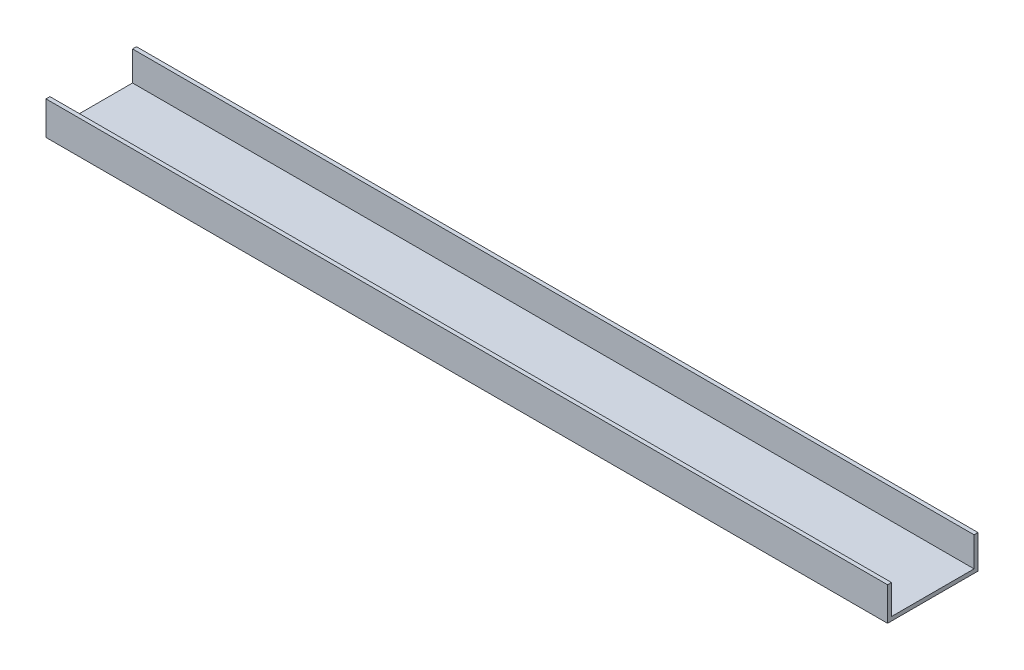
ISO-10303-21;
HEADER;
FILE_DESCRIPTION(('STEP AP214'),'2;1');
FILE_NAME('part.step','',(''),(''),'','','');
FILE_SCHEMA(('AUTOMOTIVE_DESIGN { 1 0 10303 214 1 1 1 1 }'));
ENDSEC;
DATA;
#1=APPLICATION_CONTEXT('core data for automotive mechanical design processes');
#2=APPLICATION_PROTOCOL_DEFINITION('international standard','automotive_design',2000,#1);
#3=PRODUCT_CONTEXT('',#1,'mechanical');
#4=PRODUCT('Part','Part','',(#3));
#5=PRODUCT_RELATED_PRODUCT_CATEGORY('part','',(#4));
#6=PRODUCT_DEFINITION_FORMATION('','',#4);
#7=PRODUCT_DEFINITION_CONTEXT('part definition',#1,'design');
#8=PRODUCT_DEFINITION('design','',#6,#7);
#9=PRODUCT_DEFINITION_SHAPE('','',#8);
#10=(LENGTH_UNIT() NAMED_UNIT(*) SI_UNIT(.MILLI.,.METRE.));
#11=(NAMED_UNIT(*) PLANE_ANGLE_UNIT() SI_UNIT($,.RADIAN.));
#12=(NAMED_UNIT(*) SI_UNIT($,.STERADIAN.) SOLID_ANGLE_UNIT());
#13=UNCERTAINTY_MEASURE_WITH_UNIT(LENGTH_MEASURE(1.E-05),#10,'distance_accuracy_value','');
#14=(GEOMETRIC_REPRESENTATION_CONTEXT(3) GLOBAL_UNCERTAINTY_ASSIGNED_CONTEXT((#13)) GLOBAL_UNIT_ASSIGNED_CONTEXT((#10,
#11,#12)) REPRESENTATION_CONTEXT('',''));
#15=CARTESIAN_POINT('',(0.,0.,0.));
#16=DIRECTION('',(0.,0.,1.));
#17=DIRECTION('',(1.,0.,0.));
#18=AXIS2_PLACEMENT_3D('',#15,#16,#17);
#19=CARTESIAN_POINT('',(214.,4.25,4.));
#20=DIRECTION('',(0.,-1.,0.));
#21=DIRECTION('',(0.,0.,-1.));
#22=AXIS2_PLACEMENT_3D('',#19,#20,#21);
#23=PLANE('',#22);
#24=DIRECTION('',(0.,0.,1.));
#25=VECTOR('',#24,1.);
#26=CARTESIAN_POINT('',(0.,4.25,4.));
#27=LINE('',#26,#25);
#28=CARTESIAN_POINT('',(0.,4.25,4.));
#29=VERTEX_POINT('',#28);
#30=CARTESIAN_POINT('',(0.,4.25,5.));
#31=VERTEX_POINT('',#30);
#32=EDGE_CURVE('E127',#29,#31,#27,.T.);
#33=ORIENTED_EDGE('',*,*,#32,.T.);
#34=DIRECTION('',(-1.,0.,0.));
#35=VECTOR('',#34,1.);
#36=CARTESIAN_POINT('',(214.,4.25,5.));
#37=LINE('',#36,#35);
#38=CARTESIAN_POINT('',(214.,4.25,5.));
#39=VERTEX_POINT('',#38);
#40=EDGE_CURVE('E11',#39,#31,#37,.T.);
#41=ORIENTED_EDGE('',*,*,#40,.F.);
#42=DIRECTION('',(0.,0.,1.));
#43=VECTOR('',#42,1.);
#44=CARTESIAN_POINT('',(214.,4.25,4.));
#45=LINE('',#44,#43);
#46=CARTESIAN_POINT('',(214.,4.25,4.));
#47=VERTEX_POINT('',#46);
#48=EDGE_CURVE('E141',#47,#39,#45,.T.);
#49=ORIENTED_EDGE('',*,*,#48,.F.);
#50=DIRECTION('',(-1.,0.,0.));
#51=VECTOR('',#50,1.);
#52=CARTESIAN_POINT('',(214.,4.25,4.));
#53=LINE('',#52,#51);
#54=EDGE_CURVE('E123',#47,#29,#53,.T.);
#55=ORIENTED_EDGE('',*,*,#54,.T.);
#56=EDGE_LOOP('',(#33,#41,#49,#55));
#57=FACE_BOUND('',#56,.T.);
#58=ADVANCED_FACE('F31',(#57),#23,.F.);
#59=CARTESIAN_POINT('',(214.,-4.25,5.));
#60=DIRECTION('',(0.,0.,-1.));
#61=DIRECTION('',(-1.,0.,0.));
#62=AXIS2_PLACEMENT_3D('',#59,#60,#61);
#63=PLANE('',#62);
#64=DIRECTION('',(0.,-1.,0.));
#65=VECTOR('',#64,1.);
#66=CARTESIAN_POINT('',(0.,-4.25,5.));
#67=LINE('',#66,#65);
#68=CARTESIAN_POINT('',(0.,-4.25,5.));
#69=VERTEX_POINT('',#68);
#70=EDGE_CURVE('E130',#31,#69,#67,.T.);
#71=ORIENTED_EDGE('',*,*,#70,.T.);
#72=DIRECTION('',(-1.,0.,0.));
#73=VECTOR('',#72,1.);
#74=CARTESIAN_POINT('',(214.,-4.25,5.));
#75=LINE('',#74,#73);
#76=CARTESIAN_POINT('',(214.,-4.25,5.));
#77=VERTEX_POINT('',#76);
#78=EDGE_CURVE('E39',#77,#69,#75,.T.);
#79=ORIENTED_EDGE('',*,*,#78,.F.);
#80=DIRECTION('',(0.,-1.,0.));
#81=VECTOR('',#80,1.);
#82=CARTESIAN_POINT('',(214.,-4.25,5.));
#83=LINE('',#82,#81);
#84=EDGE_CURVE('E90',#39,#77,#83,.T.);
#85=ORIENTED_EDGE('',*,*,#84,.F.);
#86=ORIENTED_EDGE('',*,*,#40,.T.);
#87=EDGE_LOOP('',(#71,#79,#85,#86));
#88=FACE_BOUND('',#87,.T.);
#89=ADVANCED_FACE('F176',(#88),#63,.F.);
#90=CARTESIAN_POINT('',(214.,-4.25,-18.));
#91=DIRECTION('',(0.,1.,0.));
#92=DIRECTION('',(0.,0.,1.));
#93=AXIS2_PLACEMENT_3D('',#90,#91,#92);
#94=PLANE('',#93);
#95=DIRECTION('',(0.,0.,-1.));
#96=VECTOR('',#95,1.);
#97=CARTESIAN_POINT('',(0.,-4.25,-18.));
#98=LINE('',#97,#96);
#99=CARTESIAN_POINT('',(0.,-4.25,-18.));
#100=VERTEX_POINT('',#99);
#101=EDGE_CURVE('E132',#69,#100,#98,.T.);
#102=ORIENTED_EDGE('',*,*,#101,.T.);
#103=DIRECTION('',(-1.,0.,0.));
#104=VECTOR('',#103,1.);
#105=CARTESIAN_POINT('',(214.,-4.25,-18.));
#106=LINE('',#105,#104);
#107=CARTESIAN_POINT('',(214.,-4.25,-18.));
#108=VERTEX_POINT('',#107);
#109=EDGE_CURVE('E148',#108,#100,#106,.T.);
#110=ORIENTED_EDGE('',*,*,#109,.F.);
#111=DIRECTION('',(0.,0.,-1.));
#112=VECTOR('',#111,1.);
#113=CARTESIAN_POINT('',(214.,-4.25,-18.));
#114=LINE('',#113,#112);
#115=EDGE_CURVE('E156',#77,#108,#114,.T.);
#116=ORIENTED_EDGE('',*,*,#115,.F.);
#117=ORIENTED_EDGE('',*,*,#78,.T.);
#118=EDGE_LOOP('',(#102,#110,#116,#117));
#119=FACE_BOUND('',#118,.T.);
#120=ADVANCED_FACE('F154',(#119),#94,.F.);
#121=CARTESIAN_POINT('',(214.,-4.25,-18.));
#122=DIRECTION('',(0.,0.,1.));
#123=DIRECTION('',(1.,0.,0.));
#124=AXIS2_PLACEMENT_3D('',#121,#122,#123);
#125=PLANE('',#124);
#126=DIRECTION('',(0.,1.,0.));
#127=VECTOR('',#126,1.);
#128=CARTESIAN_POINT('',(0.,-4.25,-18.));
#129=LINE('',#128,#127);
#130=CARTESIAN_POINT('',(0.,4.25,-18.));
#131=VERTEX_POINT('',#130);
#132=EDGE_CURVE('E134',#100,#131,#129,.T.);
#133=ORIENTED_EDGE('',*,*,#132,.T.);
#134=DIRECTION('',(-1.,0.,0.));
#135=VECTOR('',#134,1.);
#136=CARTESIAN_POINT('',(214.,4.25,-18.));
#137=LINE('',#136,#135);
#138=CARTESIAN_POINT('',(214.,4.25,-18.));
#139=VERTEX_POINT('',#138);
#140=EDGE_CURVE('E145',#139,#131,#137,.T.);
#141=ORIENTED_EDGE('',*,*,#140,.F.);
#142=DIRECTION('',(0.,1.,0.));
#143=VECTOR('',#142,1.);
#144=CARTESIAN_POINT('',(214.,-4.25,-18.));
#145=LINE('',#144,#143);
#146=EDGE_CURVE('E168',#108,#139,#145,.T.);
#147=ORIENTED_EDGE('',*,*,#146,.F.);
#148=ORIENTED_EDGE('',*,*,#109,.T.);
#149=EDGE_LOOP('',(#133,#141,#147,#148));
#150=FACE_BOUND('',#149,.T.);
#151=ADVANCED_FACE('F164',(#150),#125,.F.);
#152=CARTESIAN_POINT('',(214.,4.25,-18.));
#153=DIRECTION('',(0.,-1.,0.));
#154=DIRECTION('',(0.,0.,-1.));
#155=AXIS2_PLACEMENT_3D('',#152,#153,#154);
#156=PLANE('',#155);
#157=DIRECTION('',(0.,0.,1.));
#158=VECTOR('',#157,1.);
#159=CARTESIAN_POINT('',(0.,4.25,-18.));
#160=LINE('',#159,#158);
#161=CARTESIAN_POINT('',(0.,4.25,-17.));
#162=VERTEX_POINT('',#161);
#163=EDGE_CURVE('E136',#131,#162,#160,.T.);
#164=ORIENTED_EDGE('',*,*,#163,.T.);
#165=DIRECTION('',(-1.,0.,0.));
#166=VECTOR('',#165,1.);
#167=CARTESIAN_POINT('',(214.,4.25,-17.));
#168=LINE('',#167,#166);
#169=CARTESIAN_POINT('',(214.,4.25,-17.));
#170=VERTEX_POINT('',#169);
#171=EDGE_CURVE('E118',#170,#162,#168,.T.);
#172=ORIENTED_EDGE('',*,*,#171,.F.);
#173=DIRECTION('',(0.,0.,1.));
#174=VECTOR('',#173,1.);
#175=CARTESIAN_POINT('',(214.,4.25,-18.));
#176=LINE('',#175,#174);
#177=EDGE_CURVE('E109',#139,#170,#176,.T.);
#178=ORIENTED_EDGE('',*,*,#177,.F.);
#179=ORIENTED_EDGE('',*,*,#140,.T.);
#180=EDGE_LOOP('',(#164,#172,#178,#179));
#181=FACE_BOUND('',#180,.T.);
#182=ADVANCED_FACE('F167',(#181),#156,.F.);
#183=CARTESIAN_POINT('',(214.,-3.25,-17.));
#184=DIRECTION('',(0.,0.,-1.));
#185=DIRECTION('',(-1.,0.,0.));
#186=AXIS2_PLACEMENT_3D('',#183,#184,#185);
#187=PLANE('',#186);
#188=DIRECTION('',(0.,-1.,0.));
#189=VECTOR('',#188,1.);
#190=CARTESIAN_POINT('',(0.,-3.25,-17.));
#191=LINE('',#190,#189);
#192=CARTESIAN_POINT('',(0.,-3.25,-17.));
#193=VERTEX_POINT('',#192);
#194=EDGE_CURVE('E117',#162,#193,#191,.T.);
#195=ORIENTED_EDGE('',*,*,#194,.T.);
#196=DIRECTION('',(-1.,0.,0.));
#197=VECTOR('',#196,1.);
#198=CARTESIAN_POINT('',(214.,-3.25,-17.));
#199=LINE('',#198,#197);
#200=CARTESIAN_POINT('',(214.,-3.25,-17.));
#201=VERTEX_POINT('',#200);
#202=EDGE_CURVE('E114',#201,#193,#199,.T.);
#203=ORIENTED_EDGE('',*,*,#202,.F.);
#204=DIRECTION('',(0.,-1.,0.));
#205=VECTOR('',#204,1.);
#206=CARTESIAN_POINT('',(214.,-3.25,-17.));
#207=LINE('',#206,#205);
#208=EDGE_CURVE('E103',#170,#201,#207,.T.);
#209=ORIENTED_EDGE('',*,*,#208,.F.);
#210=ORIENTED_EDGE('',*,*,#171,.T.);
#211=EDGE_LOOP('',(#195,#203,#209,#210));
#212=FACE_BOUND('',#211,.T.);
#213=ADVANCED_FACE('F115',(#212),#187,.F.);
#214=CARTESIAN_POINT('',(214.,-3.25,4.));
#215=DIRECTION('',(0.,-1.,0.));
#216=DIRECTION('',(0.,0.,-1.));
#217=AXIS2_PLACEMENT_3D('',#214,#215,#216);
#218=PLANE('',#217);
#219=DIRECTION('',(0.,0.,1.));
#220=VECTOR('',#219,1.);
#221=CARTESIAN_POINT('',(0.,-3.25,4.));
#222=LINE('',#221,#220);
#223=CARTESIAN_POINT('',(0.,-3.25,4.));
#224=VERTEX_POINT('',#223);
#225=EDGE_CURVE('E76',#193,#224,#222,.T.);
#226=ORIENTED_EDGE('',*,*,#225,.T.);
#227=DIRECTION('',(-1.,0.,0.));
#228=VECTOR('',#227,1.);
#229=CARTESIAN_POINT('',(214.,-3.25,4.));
#230=LINE('',#229,#228);
#231=CARTESIAN_POINT('',(214.,-3.25,4.));
#232=VERTEX_POINT('',#231);
#233=EDGE_CURVE('E119',#232,#224,#230,.T.);
#234=ORIENTED_EDGE('',*,*,#233,.F.);
#235=DIRECTION('',(0.,0.,1.));
#236=VECTOR('',#235,1.);
#237=CARTESIAN_POINT('',(214.,-3.25,4.));
#238=LINE('',#237,#236);
#239=EDGE_CURVE('E107',#201,#232,#238,.T.);
#240=ORIENTED_EDGE('',*,*,#239,.F.);
#241=ORIENTED_EDGE('',*,*,#202,.T.);
#242=EDGE_LOOP('',(#226,#234,#240,#241));
#243=FACE_BOUND('',#242,.T.);
#244=ADVANCED_FACE('F121',(#243),#218,.F.);
#245=CARTESIAN_POINT('',(214.,4.25,4.));
#246=DIRECTION('',(0.,0.,1.));
#247=DIRECTION('',(0.,-1.,0.));
#248=AXIS2_PLACEMENT_3D('',#245,#246,#247);
#249=PLANE('',#248);
#250=DIRECTION('',(0.,1.,0.));
#251=VECTOR('',#250,1.);
#252=CARTESIAN_POINT('',(0.,4.25,4.));
#253=LINE('',#252,#251);
#254=EDGE_CURVE('E82',#224,#29,#253,.T.);
#255=ORIENTED_EDGE('',*,*,#254,.T.);
#256=ORIENTED_EDGE('',*,*,#54,.F.);
#257=DIRECTION('',(0.,1.,0.));
#258=VECTOR('',#257,1.);
#259=CARTESIAN_POINT('',(214.,4.25,4.));
#260=LINE('',#259,#258);
#261=EDGE_CURVE('E47',#232,#47,#260,.T.);
#262=ORIENTED_EDGE('',*,*,#261,.F.);
#263=ORIENTED_EDGE('',*,*,#233,.T.);
#264=EDGE_LOOP('',(#255,#256,#262,#263));
#265=FACE_BOUND('',#264,.T.);
#266=ADVANCED_FACE('F192',(#265),#249,.F.);
#267=CARTESIAN_POINT('',(214.,4.25,5.));
#268=DIRECTION('',(-1.,0.,0.));
#269=DIRECTION('',(0.,0.,1.));
#270=AXIS2_PLACEMENT_3D('',#267,#268,#269);
#271=PLANE('',#270);
#272=ORIENTED_EDGE('',*,*,#48,.T.);
#273=ORIENTED_EDGE('',*,*,#84,.T.);
#274=ORIENTED_EDGE('',*,*,#115,.T.);
#275=ORIENTED_EDGE('',*,*,#146,.T.);
#276=ORIENTED_EDGE('',*,*,#177,.T.);
#277=ORIENTED_EDGE('',*,*,#208,.T.);
#278=ORIENTED_EDGE('',*,*,#239,.T.);
#279=ORIENTED_EDGE('',*,*,#261,.T.);
#280=EDGE_LOOP('',(#272,#273,#274,#275,#276,#277,#278,#279));
#281=FACE_BOUND('',#280,.T.);
#282=ADVANCED_FACE('F105',(#281),#271,.F.);
#283=CARTESIAN_POINT('',(0.,4.25,5.));
#284=DIRECTION('',(-1.,0.,0.));
#285=DIRECTION('',(0.,0.,1.));
#286=AXIS2_PLACEMENT_3D('',#283,#284,#285);
#287=PLANE('',#286);
#288=ORIENTED_EDGE('',*,*,#32,.F.);
#289=ORIENTED_EDGE('',*,*,#254,.F.);
#290=ORIENTED_EDGE('',*,*,#225,.F.);
#291=ORIENTED_EDGE('',*,*,#194,.F.);
#292=ORIENTED_EDGE('',*,*,#163,.F.);
#293=ORIENTED_EDGE('',*,*,#132,.F.);
#294=ORIENTED_EDGE('',*,*,#101,.F.);
#295=ORIENTED_EDGE('',*,*,#70,.F.);
#296=EDGE_LOOP('',(#288,#289,#290,#291,#292,#293,#294,#295));
#297=FACE_BOUND('',#296,.T.);
#298=ADVANCED_FACE('F160',(#297),#287,.T.);
#299=CLOSED_SHELL('',(#58,#89,#120,#151,#182,#213,#244,#266,#282,#298));
#300=MANIFOLD_SOLID_BREP('B2',#299);
#301=ADVANCED_BREP_SHAPE_REPRESENTATION('',(#18,#300),#14);
#302=SHAPE_DEFINITION_REPRESENTATION(#9,#301);
ENDSEC;
END-ISO-10303-21;
